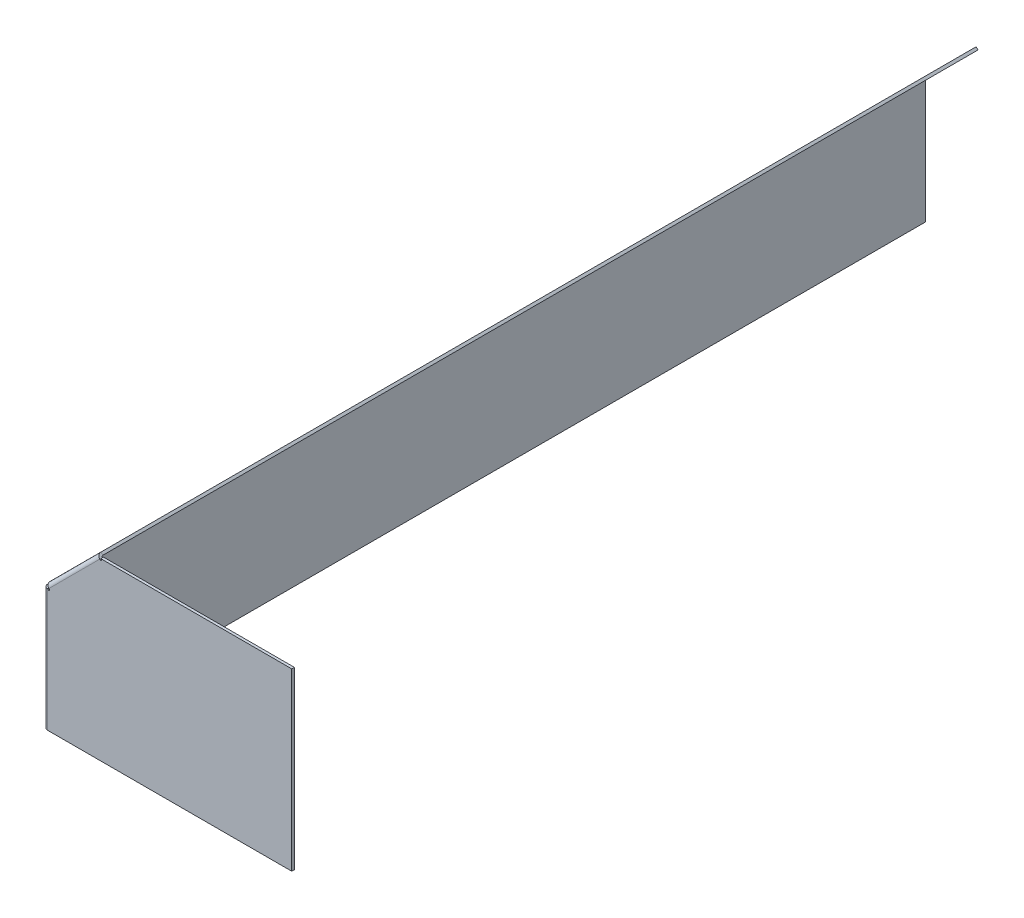
ISO-10303-21;
HEADER;
FILE_DESCRIPTION(('STEP AP214'),'2;1');
FILE_NAME('part.step','',(''),(''),'','','');
FILE_SCHEMA(('AUTOMOTIVE_DESIGN { 1 0 10303 214 1 1 1 1 }'));
ENDSEC;
DATA;
#1=APPLICATION_CONTEXT('core data for automotive mechanical design processes');
#2=APPLICATION_PROTOCOL_DEFINITION('international standard','automotive_design',2000,#1);
#3=PRODUCT_CONTEXT('',#1,'mechanical');
#4=PRODUCT('Part','Part','',(#3));
#5=PRODUCT_RELATED_PRODUCT_CATEGORY('part','',(#4));
#6=PRODUCT_DEFINITION_FORMATION('','',#4);
#7=PRODUCT_DEFINITION_CONTEXT('part definition',#1,'design');
#8=PRODUCT_DEFINITION('design','',#6,#7);
#9=PRODUCT_DEFINITION_SHAPE('','',#8);
#10=(LENGTH_UNIT() NAMED_UNIT(*) SI_UNIT(.MILLI.,.METRE.));
#11=(NAMED_UNIT(*) PLANE_ANGLE_UNIT() SI_UNIT($,.RADIAN.));
#12=(NAMED_UNIT(*) SI_UNIT($,.STERADIAN.) SOLID_ANGLE_UNIT());
#13=UNCERTAINTY_MEASURE_WITH_UNIT(LENGTH_MEASURE(1.E-05),#10,'distance_accuracy_value','');
#14=(GEOMETRIC_REPRESENTATION_CONTEXT(3) GLOBAL_UNCERTAINTY_ASSIGNED_CONTEXT((#13)) GLOBAL_UNIT_ASSIGNED_CONTEXT((#10,
#11,#12)) REPRESENTATION_CONTEXT('',''));
#15=CARTESIAN_POINT('',(0.,0.,0.));
#16=DIRECTION('',(0.,0.,1.));
#17=DIRECTION('',(1.,0.,0.));
#18=AXIS2_PLACEMENT_3D('',#15,#16,#17);
#19=CARTESIAN_POINT('',(0.,0.,-1.5));
#20=DIRECTION('',(0.,0.,-1.));
#21=DIRECTION('',(-1.,0.,0.));
#22=AXIS2_PLACEMENT_3D('',#19,#20,#21);
#23=PLANE('',#22);
#24=DIRECTION('',(-0.707106781186547,-0.707106781186547,0.));
#25=VECTOR('',#24,1.);
#26=CARTESIAN_POINT('',(-38.4184849731982,49.479145144978,-1.49999999999999));
#27=LINE('',#26,#25);
#28=CARTESIAN_POINT('',(-38.4184849731982,49.479145144978,-1.49999999999999));
#29=VERTEX_POINT('',#28);
#30=CARTESIAN_POINT('',(-38.9488150590881,48.9488150590881,-1.49999999999999));
#31=VERTEX_POINT('',#30);
#32=EDGE_CURVE('E378',#29,#31,#27,.T.);
#33=ORIENTED_EDGE('',*,*,#32,.F.);
#34=DIRECTION('',(0.707106781186547,-0.707106781186547,0.));
#35=VECTOR('',#34,1.);
#36=CARTESIAN_POINT('',(-38.9393398282202,50.,-1.5));
#37=LINE('',#36,#35);
#38=CARTESIAN_POINT('',(-38.9393398282202,50.,-1.5));
#39=VERTEX_POINT('',#38);
#40=EDGE_CURVE('E747',#39,#29,#37,.T.);
#41=ORIENTED_EDGE('',*,*,#40,.F.);
#42=DIRECTION('',(-1.,0.,0.));
#43=VECTOR('',#42,1.);
#44=CARTESIAN_POINT('',(-40.,50.,-1.5));
#45=LINE('',#44,#43);
#46=CARTESIAN_POINT('',(70.,50.,-1.5));
#47=VERTEX_POINT('',#46);
#48=EDGE_CURVE('E335',#47,#39,#45,.T.);
#49=ORIENTED_EDGE('',*,*,#48,.F.);
#50=DIRECTION('',(0.,1.,0.));
#51=VECTOR('',#50,1.);
#52=CARTESIAN_POINT('',(70.,-50.,-1.5));
#53=LINE('',#52,#51);
#54=CARTESIAN_POINT('',(70.,-50.,-1.5));
#55=VERTEX_POINT('',#54);
#56=EDGE_CURVE('E344',#55,#47,#53,.T.);
#57=ORIENTED_EDGE('',*,*,#56,.F.);
#58=DIRECTION('',(1.,0.,0.));
#59=VECTOR('',#58,1.);
#60=CARTESIAN_POINT('',(-70.,-50.,-1.5));
#61=LINE('',#60,#59);
#62=CARTESIAN_POINT('',(-69.2634,-50.,-1.5));
#63=VERTEX_POINT('',#62);
#64=EDGE_CURVE('E343',#63,#55,#61,.T.);
#65=ORIENTED_EDGE('',*,*,#64,.F.);
#66=DIRECTION('',(0.,1.,0.));
#67=VECTOR('',#66,1.);
#68=CARTESIAN_POINT('',(-69.2634,20.,-1.5));
#69=LINE('',#68,#67);
#70=CARTESIAN_POINT('',(-69.2634,20.,-1.5));
#71=VERTEX_POINT('',#70);
#72=EDGE_CURVE('E436',#71,#63,#69,.F.);
#73=ORIENTED_EDGE('',*,*,#72,.F.);
#74=DIRECTION('',(-1.,0.,0.));
#75=VECTOR('',#74,1.);
#76=CARTESIAN_POINT('',(-68.5134,20.,-1.5));
#77=LINE('',#76,#75);
#78=CARTESIAN_POINT('',(-69.1291698818238,20.,-1.5));
#79=VERTEX_POINT('',#78);
#80=EDGE_CURVE('E59',#79,#71,#77,.T.);
#81=ORIENTED_EDGE('',*,*,#80,.F.);
#82=DIRECTION('',(-0.707106781186547,0.707106781186547,0.));
#83=VECTOR('',#82,1.);
#84=CARTESIAN_POINT('',(-68.5134,19.3842301181762,-1.49999999999999));
#85=LINE('',#84,#83);
#86=CARTESIAN_POINT('',(-68.5134,19.3842301181762,-1.49999999999999));
#87=VERTEX_POINT('',#86);
#88=EDGE_CURVE('E52',#87,#79,#85,.T.);
#89=ORIENTED_EDGE('',*,*,#88,.F.);
#90=DIRECTION('',(-0.70710678118655,-0.707106781186545,0.));
#91=VECTOR('',#90,1.);
#92=CARTESIAN_POINT('',(-67.9830699141101,19.9145602040661,-1.49999999999999));
#93=LINE('',#92,#91);
#94=CARTESIAN_POINT('',(-67.9830699141101,19.9145602040661,-1.49999999999999));
#95=VERTEX_POINT('',#94);
#96=EDGE_CURVE('E755',#95,#87,#93,.T.);
#97=ORIENTED_EDGE('',*,*,#96,.F.);
#98=DIRECTION('',(0.70710678118655,-0.707106781186545,0.));
#99=VECTOR('',#98,1.);
#100=CARTESIAN_POINT('',(-68.5134,20.444890289956,-1.49999999999999));
#101=LINE('',#100,#99);
#102=CARTESIAN_POINT('',(-68.5134,20.444890289956,-1.49999999999999));
#103=VERTEX_POINT('',#102);
#104=EDGE_CURVE('E381',#103,#95,#101,.T.);
#105=ORIENTED_EDGE('',*,*,#104,.F.);
#106=DIRECTION('',(0.707106781186547,0.707106781186547,0.));
#107=VECTOR('',#106,1.);
#108=CARTESIAN_POINT('',(-39.479145144978,49.479145144978,-1.49999999999999));
#109=LINE('',#108,#107);
#110=CARTESIAN_POINT('',(-39.479145144978,49.479145144978,-1.49999999999999));
#111=VERTEX_POINT('',#110);
#112=EDGE_CURVE('E217',#111,#103,#109,.F.);
#113=ORIENTED_EDGE('',*,*,#112,.F.);
#114=DIRECTION('',(-0.707106781186547,0.707106781186547,0.));
#115=VECTOR('',#114,1.);
#116=CARTESIAN_POINT('',(-38.9488150590881,48.9488150590881,-1.49999999999999));
#117=LINE('',#116,#115);
#118=EDGE_CURVE('E380',#31,#111,#117,.T.);
#119=ORIENTED_EDGE('',*,*,#118,.F.);
#120=EDGE_LOOP('',(#33,#41,#49,#57,#65,#73,#81,#89,#97,#105,#113,#119));
#121=FACE_BOUND('',#120,.T.);
#122=ADVANCED_FACE('F37',(#121),#23,.T.);
#123=CARTESIAN_POINT('',(0.,0.,0.));
#124=DIRECTION('',(0.,0.,-1.));
#125=DIRECTION('',(-1.,0.,0.));
#126=AXIS2_PLACEMENT_3D('',#123,#124,#125);
#127=PLANE('',#126);
#128=DIRECTION('',(-0.707106781186548,0.707106781186548,0.));
#129=VECTOR('',#128,1.);
#130=CARTESIAN_POINT('',(5.5303300858899,5.5303300858899,0.));
#131=LINE('',#130,#129);
#132=CARTESIAN_POINT('',(-38.4184849731982,49.479145144978,0.));
#133=VERTEX_POINT('',#132);
#134=CARTESIAN_POINT('',(-38.9393398282202,50.,0.));
#135=VERTEX_POINT('',#134);
#136=EDGE_CURVE('E384',#133,#135,#131,.T.);
#137=ORIENTED_EDGE('',*,*,#136,.F.);
#138=DIRECTION('',(0.707106781186548,0.707106781186548,0.));
#139=VECTOR('',#138,1.);
#140=CARTESIAN_POINT('',(-43.9488150590881,43.9488150590881,0.));
#141=LINE('',#140,#139);
#142=CARTESIAN_POINT('',(-38.9488150590881,48.9488150590881,0.));
#143=VERTEX_POINT('',#142);
#144=EDGE_CURVE('E11',#143,#133,#141,.T.);
#145=ORIENTED_EDGE('',*,*,#144,.F.);
#146=DIRECTION('',(0.707106781186548,-0.707106781186548,0.));
#147=VECTOR('',#146,1.);
#148=CARTESIAN_POINT('',(4.99999999999999,4.99999999999999,0.));
#149=LINE('',#148,#147);
#150=CARTESIAN_POINT('',(-39.479145144978,49.479145144978,0.));
#151=VERTEX_POINT('',#150);
#152=EDGE_CURVE('E45',#151,#143,#149,.T.);
#153=ORIENTED_EDGE('',*,*,#152,.F.);
#154=DIRECTION('',(0.707106781186547,0.707106781186547,0.));
#155=VECTOR('',#154,1.);
#156=CARTESIAN_POINT('',(-39.479145144978,49.479145144978,0.));
#157=LINE('',#156,#155);
#158=CARTESIAN_POINT('',(-68.5134,20.444890289956,0.));
#159=VERTEX_POINT('',#158);
#160=EDGE_CURVE('E213',#151,#159,#157,.F.);
#161=ORIENTED_EDGE('',*,*,#160,.T.);
#162=DIRECTION('',(-0.70710678118655,0.707106781186545,0.));
#163=VECTOR('',#162,1.);
#164=CARTESIAN_POINT('',(-24.0342548550218,-24.0342548550219,0.));
#165=LINE('',#164,#163);
#166=CARTESIAN_POINT('',(-67.9830699141101,19.9145602040661,0.));
#167=VERTEX_POINT('',#166);
#168=EDGE_CURVE('E386',#167,#159,#165,.T.);
#169=ORIENTED_EDGE('',*,*,#168,.F.);
#170=DIRECTION('',(0.70710678118655,0.707106781186545,0.));
#171=VECTOR('',#170,1.);
#172=CARTESIAN_POINT('',(-43.9488150590879,43.9488150590882,0.));
#173=LINE('',#172,#171);
#174=CARTESIAN_POINT('',(-68.5134,19.3842301181762,0.));
#175=VERTEX_POINT('',#174);
#176=EDGE_CURVE('E366',#175,#167,#173,.T.);
#177=ORIENTED_EDGE('',*,*,#176,.F.);
#178=DIRECTION('',(0.707106781186548,-0.707106781186548,0.));
#179=VECTOR('',#178,1.);
#180=CARTESIAN_POINT('',(-24.5645849409119,-24.5645849409119,0.));
#181=LINE('',#180,#179);
#182=CARTESIAN_POINT('',(-69.1291698818238,20.,0.));
#183=VERTEX_POINT('',#182);
#184=EDGE_CURVE('E391',#183,#175,#181,.T.);
#185=ORIENTED_EDGE('',*,*,#184,.F.);
#186=DIRECTION('',(1.,0.,0.));
#187=VECTOR('',#186,1.);
#188=CARTESIAN_POINT('',(0.,20.,0.));
#189=LINE('',#188,#187);
#190=CARTESIAN_POINT('',(-69.2634,20.,0.));
#191=VERTEX_POINT('',#190);
#192=EDGE_CURVE('E360',#191,#183,#189,.T.);
#193=ORIENTED_EDGE('',*,*,#192,.F.);
#194=DIRECTION('',(0.,1.,0.));
#195=VECTOR('',#194,1.);
#196=CARTESIAN_POINT('',(-69.2634,20.,0.));
#197=LINE('',#196,#195);
#198=CARTESIAN_POINT('',(-69.2634,-50.,0.));
#199=VERTEX_POINT('',#198);
#200=EDGE_CURVE('E424',#191,#199,#197,.F.);
#201=ORIENTED_EDGE('',*,*,#200,.T.);
#202=DIRECTION('',(1.,0.,0.));
#203=VECTOR('',#202,1.);
#204=CARTESIAN_POINT('',(-70.,-50.,0.));
#205=LINE('',#204,#203);
#206=CARTESIAN_POINT('',(70.,-50.,0.));
#207=VERTEX_POINT('',#206);
#208=EDGE_CURVE('E347',#199,#207,#205,.T.);
#209=ORIENTED_EDGE('',*,*,#208,.T.);
#210=DIRECTION('',(0.,1.,0.));
#211=VECTOR('',#210,1.);
#212=CARTESIAN_POINT('',(70.,-50.,0.));
#213=LINE('',#212,#211);
#214=CARTESIAN_POINT('',(70.,50.,0.));
#215=VERTEX_POINT('',#214);
#216=EDGE_CURVE('E351',#207,#215,#213,.T.);
#217=ORIENTED_EDGE('',*,*,#216,.T.);
#218=DIRECTION('',(-1.,0.,0.));
#219=VECTOR('',#218,1.);
#220=CARTESIAN_POINT('',(-40.,50.,0.));
#221=LINE('',#220,#219);
#222=EDGE_CURVE('E354',#215,#135,#221,.T.);
#223=ORIENTED_EDGE('',*,*,#222,.T.);
#224=EDGE_LOOP('',(#137,#145,#153,#161,#169,#177,#185,#193,#201,#209,#217,#223));
#225=FACE_BOUND('',#224,.T.);
#226=ADVANCED_FACE('F321',(#225),#127,.F.);
#227=CARTESIAN_POINT('',(-40.,50.,-1.5));
#228=DIRECTION('',(0.,1.,0.));
#229=DIRECTION('',(0.,0.,1.));
#230=AXIS2_PLACEMENT_3D('',#227,#228,#229);
#231=PLANE('',#230);
#232=ORIENTED_EDGE('',*,*,#48,.T.);
#233=DIRECTION('',(0.,0.,1.));
#234=VECTOR('',#233,1.);
#235=CARTESIAN_POINT('',(-38.9393398282202,50.,-1.5));
#236=LINE('',#235,#234);
#237=EDGE_CURVE('E337',#39,#135,#236,.T.);
#238=ORIENTED_EDGE('',*,*,#237,.T.);
#239=ORIENTED_EDGE('',*,*,#222,.F.);
#240=DIRECTION('',(0.,0.,1.));
#241=VECTOR('',#240,1.);
#242=CARTESIAN_POINT('',(70.,50.,-1.5));
#243=LINE('',#242,#241);
#244=EDGE_CURVE('E339',#47,#215,#243,.T.);
#245=ORIENTED_EDGE('',*,*,#244,.F.);
#246=EDGE_LOOP('',(#232,#238,#239,#245));
#247=FACE_BOUND('',#246,.T.);
#248=ADVANCED_FACE('F318',(#247),#231,.T.);
#249=CARTESIAN_POINT('',(-68.5134,20.,-1.5));
#250=DIRECTION('',(0.,1.,0.));
#251=DIRECTION('',(0.,0.,1.));
#252=AXIS2_PLACEMENT_3D('',#249,#250,#251);
#253=PLANE('',#252);
#254=ORIENTED_EDGE('',*,*,#192,.T.);
#255=DIRECTION('',(0.,0.,-1.));
#256=VECTOR('',#255,1.);
#257=CARTESIAN_POINT('',(-69.1291698818238,20.,-1.5));
#258=LINE('',#257,#256);
#259=EDGE_CURVE('E364',#183,#79,#258,.T.);
#260=ORIENTED_EDGE('',*,*,#259,.T.);
#261=ORIENTED_EDGE('',*,*,#80,.T.);
#262=DIRECTION('',(0.,0.,1.));
#263=VECTOR('',#262,1.);
#264=CARTESIAN_POINT('',(-69.2634,20.,-1.5));
#265=LINE('',#264,#263);
#266=EDGE_CURVE('E430',#71,#191,#265,.T.);
#267=ORIENTED_EDGE('',*,*,#266,.T.);
#268=EDGE_LOOP('',(#254,#260,#261,#267));
#269=FACE_BOUND('',#268,.T.);
#270=ADVANCED_FACE('F315',(#269),#253,.T.);
#271=CARTESIAN_POINT('',(70.,-50.,-1.5));
#272=DIRECTION('',(1.,0.,0.));
#273=DIRECTION('',(0.,0.,-1.));
#274=AXIS2_PLACEMENT_3D('',#271,#272,#273);
#275=PLANE('',#274);
#276=ORIENTED_EDGE('',*,*,#216,.F.);
#277=DIRECTION('',(0.,0.,1.));
#278=VECTOR('',#277,1.);
#279=CARTESIAN_POINT('',(70.,-50.,-1.5));
#280=LINE('',#279,#278);
#281=EDGE_CURVE('E357',#55,#207,#280,.T.);
#282=ORIENTED_EDGE('',*,*,#281,.F.);
#283=ORIENTED_EDGE('',*,*,#56,.T.);
#284=ORIENTED_EDGE('',*,*,#244,.T.);
#285=EDGE_LOOP('',(#276,#282,#283,#284));
#286=FACE_BOUND('',#285,.T.);
#287=ADVANCED_FACE('F39',(#286),#275,.T.);
#288=CARTESIAN_POINT('',(-70.,-50.,-1.5));
#289=DIRECTION('',(0.,-1.,0.));
#290=DIRECTION('',(0.,0.,-1.));
#291=AXIS2_PLACEMENT_3D('',#288,#289,#290);
#292=PLANE('',#291);
#293=DIRECTION('',(0.,0.,1.));
#294=VECTOR('',#293,1.);
#295=CARTESIAN_POINT('',(-69.2634,-50.,-1.5));
#296=LINE('',#295,#294);
#297=EDGE_CURVE('E441',#63,#199,#296,.T.);
#298=ORIENTED_EDGE('',*,*,#297,.F.);
#299=ORIENTED_EDGE('',*,*,#64,.T.);
#300=ORIENTED_EDGE('',*,*,#281,.T.);
#301=ORIENTED_EDGE('',*,*,#208,.F.);
#302=EDGE_LOOP('',(#298,#299,#300,#301));
#303=FACE_BOUND('',#302,.T.);
#304=ADVANCED_FACE('F310',(#303),#292,.T.);
#305=CARTESIAN_POINT('',(-69.2634,-50.,-2.23660000000001));
#306=DIRECTION('',(0.,-1.,0.));
#307=DIRECTION('',(0.,0.,-1.));
#308=AXIS2_PLACEMENT_3D('',#305,#306,#307);
#309=PLANE('',#308);
#310=DIRECTION('',(-1.,0.,0.));
#311=VECTOR('',#310,1.);
#312=CARTESIAN_POINT('',(-70.,-50.,-2.23660000000001));
#313=LINE('',#312,#311);
#314=CARTESIAN_POINT('',(-70.,-50.,-2.23660000000001));
#315=VERTEX_POINT('',#314);
#316=CARTESIAN_POINT('',(-71.5,-50.,-2.2366));
#317=VERTEX_POINT('',#316);
#318=EDGE_CURVE('E385',#315,#317,#313,.T.);
#319=ORIENTED_EDGE('',*,*,#318,.F.);
#320=CARTESIAN_POINT('',(-69.2634,-50.,-2.23660000000001));
#321=DIRECTION('',(0.,1.,0.));
#322=DIRECTION('',(0.,0.,1.));
#323=AXIS2_PLACEMENT_3D('',#320,#321,#322);
#324=CIRCLE('',#323,0.736600000000004);
#325=EDGE_CURVE('E433',#63,#315,#324,.F.);
#326=ORIENTED_EDGE('',*,*,#325,.F.);
#327=ORIENTED_EDGE('',*,*,#297,.T.);
#328=CARTESIAN_POINT('',(-69.2634,-50.,-2.23660000000001));
#329=DIRECTION('',(0.,1.,0.));
#330=DIRECTION('',(0.,0.,1.));
#331=AXIS2_PLACEMENT_3D('',#328,#329,#330);
#332=CIRCLE('',#331,2.2366);
#333=EDGE_CURVE('E426',#199,#317,#332,.F.);
#334=ORIENTED_EDGE('',*,*,#333,.T.);
#335=EDGE_LOOP('',(#319,#326,#327,#334));
#336=FACE_BOUND('',#335,.T.);
#337=ADVANCED_FACE('F307',(#336),#309,.T.);
#338=CARTESIAN_POINT('',(-69.2634,20.,-2.23660000000001));
#339=DIRECTION('',(0.,-1.,0.));
#340=DIRECTION('',(0.,0.,-1.));
#341=AXIS2_PLACEMENT_3D('',#338,#339,#340);
#342=PLANE('',#341);
#343=CARTESIAN_POINT('',(-69.2634,20.,-2.23660000000001));
#344=DIRECTION('',(0.,1.,0.));
#345=DIRECTION('',(0.,0.,1.));
#346=AXIS2_PLACEMENT_3D('',#343,#344,#345);
#347=CIRCLE('',#346,0.736600000000004);
#348=CARTESIAN_POINT('',(-70.,20.,-2.23660000000001));
#349=VERTEX_POINT('',#348);
#350=EDGE_CURVE('E421',#349,#71,#347,.T.);
#351=ORIENTED_EDGE('',*,*,#350,.F.);
#352=DIRECTION('',(-1.,0.,0.));
#353=VECTOR('',#352,1.);
#354=CARTESIAN_POINT('',(-70.,20.,-2.23660000000001));
#355=LINE('',#354,#353);
#356=CARTESIAN_POINT('',(-71.5,20.,-2.2366));
#357=VERTEX_POINT('',#356);
#358=EDGE_CURVE('E396',#349,#357,#355,.T.);
#359=ORIENTED_EDGE('',*,*,#358,.T.);
#360=CARTESIAN_POINT('',(-69.2634,20.,-2.23660000000001));
#361=DIRECTION('',(0.,1.,0.));
#362=DIRECTION('',(0.,0.,1.));
#363=AXIS2_PLACEMENT_3D('',#360,#361,#362);
#364=CIRCLE('',#363,2.2366);
#365=EDGE_CURVE('E427',#357,#191,#364,.T.);
#366=ORIENTED_EDGE('',*,*,#365,.T.);
#367=ORIENTED_EDGE('',*,*,#266,.F.);
#368=EDGE_LOOP('',(#351,#359,#366,#367));
#369=FACE_BOUND('',#368,.T.);
#370=ADVANCED_FACE('F302',(#369),#342,.F.);
#371=CARTESIAN_POINT('',(-69.2634,20.,-2.23660000000001));
#372=DIRECTION('',(0.,1.,0.));
#373=DIRECTION('',(-1.,0.,0.));
#374=AXIS2_PLACEMENT_3D('',#371,#372,#373);
#375=CYLINDRICAL_SURFACE('',#374,2.2366);
#376=ORIENTED_EDGE('',*,*,#200,.F.);
#377=ORIENTED_EDGE('',*,*,#365,.F.);
#378=DIRECTION('',(0.,1.,0.));
#379=VECTOR('',#378,1.);
#380=CARTESIAN_POINT('',(-71.5,0.,-2.2366));
#381=LINE('',#380,#379);
#382=EDGE_CURVE('E398',#317,#357,#381,.T.);
#383=ORIENTED_EDGE('',*,*,#382,.F.);
#384=ORIENTED_EDGE('',*,*,#333,.F.);
#385=EDGE_LOOP('',(#376,#377,#383,#384));
#386=FACE_BOUND('',#385,.T.);
#387=ADVANCED_FACE('F299',(#386),#375,.T.);
#388=CARTESIAN_POINT('',(-69.2634,20.,-2.23660000000001));
#389=DIRECTION('',(0.,1.,0.));
#390=DIRECTION('',(-1.,0.,0.));
#391=AXIS2_PLACEMENT_3D('',#388,#389,#390);
#392=CYLINDRICAL_SURFACE('',#391,0.736600000000004);
#393=ORIENTED_EDGE('',*,*,#72,.T.);
#394=ORIENTED_EDGE('',*,*,#325,.T.);
#395=DIRECTION('',(0.,1.,0.));
#396=VECTOR('',#395,1.);
#397=CARTESIAN_POINT('',(-70.,-50.,-2.23660000000001));
#398=LINE('',#397,#396);
#399=EDGE_CURVE('E389',#315,#349,#398,.T.);
#400=ORIENTED_EDGE('',*,*,#399,.T.);
#401=ORIENTED_EDGE('',*,*,#350,.T.);
#402=EDGE_LOOP('',(#393,#394,#400,#401));
#403=FACE_BOUND('',#402,.T.);
#404=ADVANCED_FACE('F291',(#403),#392,.F.);
#405=CARTESIAN_POINT('',(-71.5,20.,-1.49999999999999));
#406=DIRECTION('',(0.,1.,0.));
#407=DIRECTION('',(0.,0.,1.));
#408=AXIS2_PLACEMENT_3D('',#405,#406,#407);
#409=PLANE('',#408);
#410=DIRECTION('',(0.,0.,1.));
#411=VECTOR('',#410,1.);
#412=CARTESIAN_POINT('',(-71.5,20.,-1.49999999999999));
#413=LINE('',#412,#411);
#414=CARTESIAN_POINT('',(-71.5000000000018,20.,-501.5));
#415=VERTEX_POINT('',#414);
#416=EDGE_CURVE('E409',#415,#357,#413,.T.);
#417=ORIENTED_EDGE('',*,*,#416,.T.);
#418=ORIENTED_EDGE('',*,*,#358,.F.);
#419=DIRECTION('',(0.,0.,1.));
#420=VECTOR('',#419,1.);
#421=CARTESIAN_POINT('',(-70.,20.,-1.5));
#422=LINE('',#421,#420);
#423=CARTESIAN_POINT('',(-70.0000000000018,20.,-501.5));
#424=VERTEX_POINT('',#423);
#425=EDGE_CURVE('E406',#424,#349,#422,.T.);
#426=ORIENTED_EDGE('',*,*,#425,.F.);
#427=DIRECTION('',(1.,0.,0.));
#428=VECTOR('',#427,1.);
#429=CARTESIAN_POINT('',(-71.5000000000018,20.,-501.5));
#430=LINE('',#429,#428);
#431=EDGE_CURVE('E419',#415,#424,#430,.T.);
#432=ORIENTED_EDGE('',*,*,#431,.F.);
#433=EDGE_LOOP('',(#417,#418,#426,#432));
#434=FACE_BOUND('',#433,.T.);
#435=ADVANCED_FACE('F288',(#434),#409,.T.);
#436=CARTESIAN_POINT('',(-71.5000000000018,-50.,-501.5));
#437=DIRECTION('',(0.,-1.,0.));
#438=DIRECTION('',(0.,0.,-1.));
#439=AXIS2_PLACEMENT_3D('',#436,#437,#438);
#440=PLANE('',#439);
#441=DIRECTION('',(0.,0.,-1.));
#442=VECTOR('',#441,1.);
#443=CARTESIAN_POINT('',(-70.0000000000018,-50.,-501.5));
#444=LINE('',#443,#442);
#445=CARTESIAN_POINT('',(-70.0000000000018,-50.,-501.5));
#446=VERTEX_POINT('',#445);
#447=EDGE_CURVE('E402',#315,#446,#444,.T.);
#448=ORIENTED_EDGE('',*,*,#447,.F.);
#449=ORIENTED_EDGE('',*,*,#318,.T.);
#450=DIRECTION('',(0.,0.,-1.));
#451=VECTOR('',#450,1.);
#452=CARTESIAN_POINT('',(-71.5000000000018,-50.,-501.5));
#453=LINE('',#452,#451);
#454=CARTESIAN_POINT('',(-71.5000000000018,-50.,-501.5));
#455=VERTEX_POINT('',#454);
#456=EDGE_CURVE('E403',#317,#455,#453,.T.);
#457=ORIENTED_EDGE('',*,*,#456,.T.);
#458=DIRECTION('',(1.,0.,0.));
#459=VECTOR('',#458,1.);
#460=CARTESIAN_POINT('',(-71.5000000000018,-50.,-501.5));
#461=LINE('',#460,#459);
#462=EDGE_CURVE('E412',#455,#446,#461,.T.);
#463=ORIENTED_EDGE('',*,*,#462,.T.);
#464=EDGE_LOOP('',(#448,#449,#457,#463));
#465=FACE_BOUND('',#464,.T.);
#466=ADVANCED_FACE('F283',(#465),#440,.T.);
#467=CARTESIAN_POINT('',(-71.5,0.,2.50041398938112E-13));
#468=DIRECTION('',(-1.,0.,0.));
#469=DIRECTION('',(0.,0.,1.));
#470=AXIS2_PLACEMENT_3D('',#467,#468,#469);
#471=PLANE('',#470);
#472=ORIENTED_EDGE('',*,*,#456,.F.);
#473=ORIENTED_EDGE('',*,*,#382,.T.);
#474=ORIENTED_EDGE('',*,*,#416,.F.);
#475=DIRECTION('',(0.,1.,0.));
#476=VECTOR('',#475,1.);
#477=CARTESIAN_POINT('',(-71.5000000000018,20.,-501.5));
#478=LINE('',#477,#476);
#479=EDGE_CURVE('E405',#455,#415,#478,.T.);
#480=ORIENTED_EDGE('',*,*,#479,.F.);
#481=EDGE_LOOP('',(#472,#473,#474,#480));
#482=FACE_BOUND('',#481,.T.);
#483=ADVANCED_FACE('F279',(#482),#471,.T.);
#484=CARTESIAN_POINT('',(-70.,0.,2.44804176929847E-13));
#485=DIRECTION('',(-1.,0.,0.));
#486=DIRECTION('',(0.,0.,1.));
#487=AXIS2_PLACEMENT_3D('',#484,#485,#486);
#488=PLANE('',#487);
#489=ORIENTED_EDGE('',*,*,#399,.F.);
#490=ORIENTED_EDGE('',*,*,#447,.T.);
#491=DIRECTION('',(0.,1.,0.));
#492=VECTOR('',#491,1.);
#493=CARTESIAN_POINT('',(-70.0000000000018,20.,-501.5));
#494=LINE('',#493,#492);
#495=EDGE_CURVE('E414',#446,#424,#494,.T.);
#496=ORIENTED_EDGE('',*,*,#495,.T.);
#497=ORIENTED_EDGE('',*,*,#425,.T.);
#498=EDGE_LOOP('',(#489,#490,#496,#497));
#499=FACE_BOUND('',#498,.T.);
#500=ADVANCED_FACE('F282',(#499),#488,.F.);
#501=CARTESIAN_POINT('',(-71.5000000000018,20.,-501.5));
#502=DIRECTION('',(0.,0.,-1.));
#503=DIRECTION('',(-1.,0.,0.));
#504=AXIS2_PLACEMENT_3D('',#501,#502,#503);
#505=PLANE('',#504);
#506=ORIENTED_EDGE('',*,*,#495,.F.);
#507=ORIENTED_EDGE('',*,*,#462,.F.);
#508=ORIENTED_EDGE('',*,*,#479,.T.);
#509=ORIENTED_EDGE('',*,*,#431,.T.);
#510=EDGE_LOOP('',(#506,#507,#508,#509));
#511=FACE_BOUND('',#510,.T.);
#512=ADVANCED_FACE('F274',(#511),#505,.T.);
#513=CARTESIAN_POINT('',(-38.4184849731982,49.479145144978,-1.49999999999999));
#514=DIRECTION('',(-0.707106781186547,0.707106781186547,0.));
#515=DIRECTION('',(-0.707106781186548,-0.707106781186548,0.));
#516=AXIS2_PLACEMENT_3D('',#513,#514,#515);
#517=PLANE('',#516);
#518=DIRECTION('',(0.,0.,1.));
#519=VECTOR('',#518,1.);
#520=CARTESIAN_POINT('',(-38.9488150590881,48.9488150590881,-1.49999999999999));
#521=LINE('',#520,#519);
#522=EDGE_CURVE('E369',#31,#143,#521,.T.);
#523=ORIENTED_EDGE('',*,*,#522,.T.);
#524=ORIENTED_EDGE('',*,*,#144,.T.);
#525=DIRECTION('',(0.,0.,1.));
#526=VECTOR('',#525,1.);
#527=CARTESIAN_POINT('',(-38.4184849731982,49.479145144978,-1.49999999999999));
#528=LINE('',#527,#526);
#529=EDGE_CURVE('E751',#29,#133,#528,.T.);
#530=ORIENTED_EDGE('',*,*,#529,.F.);
#531=ORIENTED_EDGE('',*,*,#32,.T.);
#532=EDGE_LOOP('',(#523,#524,#530,#531));
#533=FACE_BOUND('',#532,.T.);
#534=ADVANCED_FACE('F270',(#533),#517,.T.);
#535=CARTESIAN_POINT('',(-38.9488150590881,48.9488150590881,-1.49999999999999));
#536=DIRECTION('',(0.707106781186547,0.707106781186547,0.));
#537=DIRECTION('',(-0.707106781186548,0.707106781186548,0.));
#538=AXIS2_PLACEMENT_3D('',#535,#536,#537);
#539=PLANE('',#538);
#540=DIRECTION('',(0.,0.,1.));
#541=VECTOR('',#540,1.);
#542=CARTESIAN_POINT('',(-39.479145144978,49.479145144978,-1.49999999999999));
#543=LINE('',#542,#541);
#544=EDGE_CURVE('E372',#111,#151,#543,.T.);
#545=ORIENTED_EDGE('',*,*,#544,.T.);
#546=ORIENTED_EDGE('',*,*,#152,.T.);
#547=ORIENTED_EDGE('',*,*,#522,.F.);
#548=ORIENTED_EDGE('',*,*,#118,.T.);
#549=EDGE_LOOP('',(#545,#546,#547,#548));
#550=FACE_BOUND('',#549,.T.);
#551=ADVANCED_FACE('F263',(#550),#539,.T.);
#552=CARTESIAN_POINT('',(-67.9830699141101,19.9145602040661,-1.49999999999999));
#553=DIRECTION('',(-0.707106781186545,0.70710678118655,0.));
#554=DIRECTION('',(-0.70710678118655,-0.707106781186545,0.));
#555=AXIS2_PLACEMENT_3D('',#552,#553,#554);
#556=PLANE('',#555);
#557=DIRECTION('',(0.,0.,1.));
#558=VECTOR('',#557,1.);
#559=CARTESIAN_POINT('',(-68.5134,19.3842301181762,-1.49999999999999));
#560=LINE('',#559,#558);
#561=EDGE_CURVE('E746',#87,#175,#560,.T.);
#562=ORIENTED_EDGE('',*,*,#561,.T.);
#563=ORIENTED_EDGE('',*,*,#176,.T.);
#564=DIRECTION('',(0.,0.,1.));
#565=VECTOR('',#564,1.);
#566=CARTESIAN_POINT('',(-67.9830699141101,19.9145602040661,-1.49999999999999));
#567=LINE('',#566,#565);
#568=EDGE_CURVE('E758',#95,#167,#567,.T.);
#569=ORIENTED_EDGE('',*,*,#568,.F.);
#570=ORIENTED_EDGE('',*,*,#96,.T.);
#571=EDGE_LOOP('',(#562,#563,#569,#570));
#572=FACE_BOUND('',#571,.T.);
#573=ADVANCED_FACE('F259',(#572),#556,.T.);
#574=CARTESIAN_POINT('',(-38.9393398282202,50.,-1.5));
#575=DIRECTION('',(-0.707106781186547,-0.707106781186547,0.));
#576=DIRECTION('',(0.707106781186548,-0.707106781186548,0.));
#577=AXIS2_PLACEMENT_3D('',#574,#575,#576);
#578=PLANE('',#577);
#579=ORIENTED_EDGE('',*,*,#529,.T.);
#580=ORIENTED_EDGE('',*,*,#136,.T.);
#581=ORIENTED_EDGE('',*,*,#237,.F.);
#582=ORIENTED_EDGE('',*,*,#40,.T.);
#583=EDGE_LOOP('',(#579,#580,#581,#582));
#584=FACE_BOUND('',#583,.T.);
#585=ADVANCED_FACE('F262',(#584),#578,.T.);
#586=CARTESIAN_POINT('',(-68.5134,20.444890289956,-1.49999999999999));
#587=DIRECTION('',(-0.707106781186545,-0.70710678118655,0.));
#588=DIRECTION('',(0.70710678118655,-0.707106781186545,0.));
#589=AXIS2_PLACEMENT_3D('',#586,#587,#588);
#590=PLANE('',#589);
#591=ORIENTED_EDGE('',*,*,#568,.T.);
#592=ORIENTED_EDGE('',*,*,#168,.T.);
#593=DIRECTION('',(0.,0.,1.));
#594=VECTOR('',#593,1.);
#595=CARTESIAN_POINT('',(-68.5134,20.444890289956,-1.49999999999999));
#596=LINE('',#595,#594);
#597=EDGE_CURVE('E735',#103,#159,#596,.T.);
#598=ORIENTED_EDGE('',*,*,#597,.F.);
#599=ORIENTED_EDGE('',*,*,#104,.T.);
#600=EDGE_LOOP('',(#591,#592,#598,#599));
#601=FACE_BOUND('',#600,.T.);
#602=ADVANCED_FACE('F258',(#601),#590,.T.);
#603=CARTESIAN_POINT('',(-68.5134,19.3842301181762,-1.49999999999999));
#604=DIRECTION('',(0.707106781186547,0.707106781186547,0.));
#605=DIRECTION('',(-0.707106781186548,0.707106781186548,0.));
#606=AXIS2_PLACEMENT_3D('',#603,#604,#605);
#607=PLANE('',#606);
#608=ORIENTED_EDGE('',*,*,#259,.F.);
#609=ORIENTED_EDGE('',*,*,#184,.T.);
#610=ORIENTED_EDGE('',*,*,#561,.F.);
#611=ORIENTED_EDGE('',*,*,#88,.T.);
#612=EDGE_LOOP('',(#608,#609,#610,#611));
#613=FACE_BOUND('',#612,.T.);
#614=ADVANCED_FACE('F246',(#613),#607,.T.);
#615=CARTESIAN_POINT('',(-68.5134,20.444890289956,0.0150000000000061));
#616=CARTESIAN_POINT('',(-68.7398275162577,20.6353538438074,0.0150000000000115));
#617=CARTESIAN_POINT('',(-68.9660919920707,20.8256672337007,-0.0436031212136046));
#618=CARTESIAN_POINT('',(-69.3871377195075,21.1747979128115,-0.269182567981528));
#619=CARTESIAN_POINT('',(-69.5817269350154,21.3334296041563,-0.436070137656224));
#620=CARTESIAN_POINT('',(-69.9124182099627,21.5922058307776,-0.852886605304439));
#621=CARTESIAN_POINT('',(-70.0484043042569,21.6922344009089,-1.10265150379684));
#622=CARTESIAN_POINT('',(-70.2438705849258,21.8157856332518,-1.64724846357659));
#623=CARTESIAN_POINT('',(-70.3032847922945,21.8392487547007,-1.94181349730964));
#624=CARTESIAN_POINT('',(-70.3212667734977,21.8212667734976,-2.23659999999994));
#625=CARTESIAN_POINT('',(-68.5134,20.444890289956,0.));
#626=CARTESIAN_POINT('',(-68.7384388579518,20.6339651892312,0.));
#627=CARTESIAN_POINT('',(-68.9633157365108,20.8228909781408,-0.0582127113636294));
#628=CARTESIAN_POINT('',(-69.3817960335652,21.1694562268692,-0.282289363806842));
#629=CARTESIAN_POINT('',(-69.5752086827196,21.3269113518606,-0.448065140292197));
#630=CARTESIAN_POINT('',(-69.9039364622584,21.5837240830734,-0.862104806104063));
#631=CARTESIAN_POINT('',(-70.0391364000492,21.6829664967012,-1.11020578850241));
#632=CARTESIAN_POINT('',(-70.2335400446604,21.8054550929863,-1.65117468184198));
#633=CARTESIAN_POINT('',(-70.2926781924416,21.8286421511181,-1.94377735408209));
#634=CARTESIAN_POINT('',(-70.3106601717799,21.8106601717798,-2.23659999999994));
#635=CARTESIAN_POINT('',(-68.5134,20.444890289956,-1.49999999999999));
#636=CARTESIAN_POINT('',(-68.5995730273613,20.4950997316056,-1.49999999999999));
#637=CARTESIAN_POINT('',(-68.6856901805233,20.5452654221533,-1.51917172636611));
#638=CARTESIAN_POINT('',(-68.8476274393334,20.6352876326374,-1.59296894633824));
#639=CARTESIAN_POINT('',(-68.9233834531443,20.6750861222853,-1.64756540388949));
#640=CARTESIAN_POINT('',(-69.0557616918337,20.7355493126487,-1.78392488606646));
#641=CARTESIAN_POINT('',(-69.1123459792785,20.7561760759305,-1.86563425905878));
#642=CARTESIAN_POINT('',(-69.2004860181165,20.7724010664425,-2.04379650838093));
#643=CARTESIAN_POINT('',(-69.2320182071442,20.7679817928558,-2.14016303132741));
#644=CARTESIAN_POINT('',(-69.25,20.75,-2.23659999999998));
#645=CARTESIAN_POINT('',(-68.5134,20.444890289956,-1.51514999999999));
#646=CARTESIAN_POINT('',(-68.5981704824723,20.4936971904836,-1.51514999999999));
#647=CARTESIAN_POINT('',(-68.6828861624078,20.5424614040378,-1.53392741241763));
#648=CARTESIAN_POINT('',(-68.8422323365317,20.6298925298357,-1.60620681012181));
#649=CARTESIAN_POINT('',(-68.9168000183256,20.6685026874666,-1.65968035655182));
#650=CARTESIAN_POINT('',(-69.0471951266524,20.7269827474674,-1.79323526887408));
#651=CARTESIAN_POINT('',(-69.1029853960287,20.7468154926807,-1.8732640866114));
#652=CARTESIAN_POINT('',(-69.1900521724484,20.7619672207744,-2.04776198882898));
#653=CARTESIAN_POINT('',(-69.2213055412927,20.7572691232374,-2.14214652666759));
#654=CARTESIAN_POINT('',(-69.2392873322651,20.739287332265,-2.23659999999998));
#655=B_SPLINE_SURFACE_WITH_KNOTS('',1,3,((#615,#616,#617,#618,#619,#620,#621,#622,#623,#624),
(#625,#626,#627,#628,#629,#630,#631,#632,#633,#634),(#635,#636,#637,#638,#639,#640,#641,#642,
#643,#644),(#645,#646,#647,#648,#649,#650,#651,#652,#653,#654)),.UNSPECIFIED.,.F.,.F.,.F.,(2,1,
1,2),(4,2,2,2,4),(-0.01,0.,1.,1.0101),(0.,0.25,0.5,0.75,1.),.UNSPECIFIED.);
#656=DIRECTION('',(-0.707106781186548,0.707106781186547,0.));
#657=VECTOR('',#656,1.);
#658=CARTESIAN_POINT('',(-69.25,20.75,-2.23659999999999));
#659=LINE('',#658,#657);
#660=CARTESIAN_POINT('',(-69.25,20.75,-2.23659999999999));
#661=VERTEX_POINT('',#660);
#662=CARTESIAN_POINT('',(-70.3106601717798,21.8106601717799,-2.23659999999999));
#663=VERTEX_POINT('',#662);
#664=EDGE_CURVE('E180',#661,#663,#659,.T.);
#665=CARTESIAN_POINT('',(-68.5134,20.444890289956,-1.49999999999999));
#666=CARTESIAN_POINT('',(-68.5241698215026,20.4511654209382,-1.4999997443344));
#667=CARTESIAN_POINT('',(-68.5349396276223,20.4574405365375,-1.50029580594561));
#668=CARTESIAN_POINT('',(-68.556458716735,20.4699702446095,-1.50147872797292));
#669=CARTESIAN_POINT('',(-68.567207999728,20.4762248370821,-1.50236558838903));
#670=CARTESIAN_POINT('',(-68.5886655502263,20.4886930065397,-1.50472827227747));
#671=CARTESIAN_POINT('',(-68.5993738177316,20.4949065835246,-1.50620409574981));
#672=CARTESIAN_POINT('',(-68.6207289569513,20.5072723417036,-1.50974106977006));
#673=CARTESIAN_POINT('',(-68.6313758286657,20.5134245228976,-1.51180222031799));
#674=CARTESIAN_POINT('',(-68.6525879403586,20.5256472535497,-1.51650490459195));
#675=CARTESIAN_POINT('',(-68.663153180337,20.5317178030078,-1.519146438318));
#676=CARTESIAN_POINT('',(-68.684181990222,20.5437572318521,-1.52500351947579));
#677=CARTESIAN_POINT('',(-68.6946455601286,20.5497261112382,-1.52821906690753));
#678=CARTESIAN_POINT('',(-68.7154512362111,20.56154240628,-1.53521643049176));
#679=CARTESIAN_POINT('',(-68.7257933423871,20.5673898219356,-1.53899824664423));
#680=CARTESIAN_POINT('',(-68.7463365900348,20.5789436885425,-1.54711903652812));
#681=CARTESIAN_POINT('',(-68.7565377315065,20.5846501394939,-1.55145801025953));
#682=CARTESIAN_POINT('',(-68.7767798883502,20.5959029152968,-1.56068266244482));
#683=CARTESIAN_POINT('',(-68.7868209037221,20.6014492401483,-1.56556834089871));
#684=CARTESIAN_POINT('',(-68.8067240327332,20.6123629881187,-1.57587463247181));
#685=CARTESIAN_POINT('',(-68.8165861463723,20.6177304112374,-1.58129524559102));
#686=CARTESIAN_POINT('',(-68.8361131272736,20.628268011098,-1.59265834777096));
#687=CARTESIAN_POINT('',(-68.8457779945358,20.6334381878398,-1.59860083683169));
#688=CARTESIAN_POINT('',(-68.8648926132229,20.6435634254862,-1.61099337491588));
#689=CARTESIAN_POINT('',(-68.874342364648,20.6485184863908,-1.61744342393934));
#690=CARTESIAN_POINT('',(-68.8930094004335,20.6581961411356,-1.63083554321652));
#691=CARTESIAN_POINT('',(-68.902226684794,20.6629187349758,-1.63777761347023));
#692=CARTESIAN_POINT('',(-68.9204119952569,20.6721146643978,-1.65213705115246));
#693=CARTESIAN_POINT('',(-68.9293800213591,20.6765879999798,-1.65955441858097));
#694=CARTESIAN_POINT('',(-68.9470506245966,20.6852692221765,-1.67484658152502));
#695=CARTESIAN_POINT('',(-68.9557532017319,20.6894771087913,-1.68272137704055));
#696=CARTESIAN_POINT('',(-68.9728773558162,20.697611881835,-1.69890942508649));
#697=CARTESIAN_POINT('',(-68.9812989327653,20.7015387682637,-1.70722267761689));
#698=CARTESIAN_POINT('',(-68.9978462122127,20.7090966666703,-1.72426761233906));
#699=CARTESIAN_POINT('',(-69.0059719147108,20.7127276786481,-1.73299929453082));
#700=CARTESIAN_POINT('',(-69.0219132837786,20.7196796666751,-1.75086005318852));
#701=CARTESIAN_POINT('',(-69.0297289503483,20.7230006427244,-1.75998912965444));
#702=CARTESIAN_POINT('',(-69.0450368329854,20.7293191443208,-1.77862268411564));
#703=CARTESIAN_POINT('',(-69.0525290490529,20.7323166698679,-1.78812716211091));
#704=CARTESIAN_POINT('',(-69.0671773953324,20.7379756351066,-1.80748862251081));
#705=CARTESIAN_POINT('',(-69.0743335255444,20.7406370747983,-1.81734560491543));
#706=CARTESIAN_POINT('',(-69.0882978744202,20.7456120426333,-1.83738832780006));
#707=CARTESIAN_POINT('',(-69.0951060930839,20.7479255707766,-1.84757406828006));
#708=CARTESIAN_POINT('',(-69.1083636313197,20.7521937279717,-1.86824976897444));
#709=CARTESIAN_POINT('',(-69.1148129508918,20.7541483570234,-1.87873972918882));
#710=CARTESIAN_POINT('',(-69.1273425680189,20.7576885931098,-1.89999859811908));
#711=CARTESIAN_POINT('',(-69.1334228655739,20.7592742001444,-1.91076750683496));
#712=CARTESIAN_POINT('',(-69.1452052047545,20.7620671582843,-1.9325583295235));
#713=CARTESIAN_POINT('',(-69.1509072463801,20.7632745093895,-1.94358024349616));
#714=CARTESIAN_POINT('',(-69.1619247510148,20.7653026329834,-1.96585052394355));
#715=CARTESIAN_POINT('',(-69.1672402140239,20.7661234054721,-1.97709889041828));
#716=CARTESIAN_POINT('',(-69.1774771701397,20.7673709805472,-1.99979497756426));
#717=CARTESIAN_POINT('',(-69.1823986632465,20.7677977831337,-2.01124269823552));
#718=CARTESIAN_POINT('',(-69.1918412370078,20.7682509758541,-2.03430991523317));
#719=CARTESIAN_POINT('',(-69.1963623176622,20.7682773659881,-2.04592941155956));
#720=CARTESIAN_POINT('',(-69.2049985899872,20.7679242572724,-2.06931218740691));
#721=CARTESIAN_POINT('',(-69.2091137816578,20.7675447584226,-2.08107546692787));
#722=CARTESIAN_POINT('',(-69.216933772118,20.7663753678422,-2.10471747067792));
#723=CARTESIAN_POINT('',(-69.2206385709077,20.7655854761115,-2.11659619490701));
#724=CARTESIAN_POINT('',(-69.2276342797427,20.7635918039057,-2.14044047012531));
#725=CARTESIAN_POINT('',(-69.230925189788,20.7623880234306,-2.15240602111452));
#726=CARTESIAN_POINT('',(-69.2370905501077,20.7595640027096,-2.17639512775193));
#727=CARTESIAN_POINT('',(-69.2399650003821,20.7579437624636,-2.18841868340013));
#728=CARTESIAN_POINT('',(-69.2452961430896,20.7542855241303,-2.21249481878067));
#729=CARTESIAN_POINT('',(-69.2477528355227,20.7522475260431,-2.22454739851301));
#730=CARTESIAN_POINT('',(-69.25,20.75,-2.23659999999998));
#731=B_SPLINE_CURVE_WITH_KNOTS('',3,(#665,#666,#667,#668,#669,#670,#671,#672,#673,#674,#675,
#676,#677,#678,#679,#680,#681,#682,#683,#684,#685,#686,#687,#688,#689,#690,#691,#692,#693,#694,
#695,#696,#697,#698,#699,#700,#701,#702,#703,#704,#705,#706,#707,#708,#709,#710,#711,#712,#713,
#714,#715,#716,#717,#718,#719,#720,#721,#722,#723,#724,#725,#726,#727,#728,#729,#730),
.UNSPECIFIED.,.F.,.F.,(4,2,2,2,2,2,2,2,2,2,2,2,2,2,2,2,2,2,2,2,2,2,2,2,2,2,2,2,2,2,2,2,4),(0.,
0.0373902631353243,0.0747805262706562,0.112170789405991,0.149561052541328,0.186951315676651,
0.224341578811989,0.261731841947319,0.299122105082649,0.336512368217982,0.373902631353321,
0.411292894488646,0.448683157623982,0.486073420759311,0.523463683894645,0.560853947029981,
0.598244210165303,0.635634473300635,0.673024736435974,0.710414999571299,0.747805262706635,
0.78519552584197,0.822585788977297,0.85997605211263,0.897366315247963,0.934756578383292,
0.972146841518623,1.00953710465396,1.04692736778929,1.08431763092462,1.12170789405995,
1.15909815719528,1.19648842033062),.UNSPECIFIED.);
#732=EDGE_CURVE('E214',#103,#661,#731,.T.);
#733=CARTESIAN_POINT('',(-68.5134,20.444890289956,0.));
#734=CARTESIAN_POINT('',(-68.5415248505055,20.4685204499411,7.76298760999204E-07));
#735=CARTESIAN_POINT('',(-68.5696496543028,20.492150563218,-0.000898180257876093));
#736=CARTESIAN_POINT('',(-68.6258369458164,20.5393484736909,-0.0044899850451309));
#737=CARTESIAN_POINT('',(-68.6538994335328,20.5629162708869,-0.00718283327574882));
#738=CARTESIAN_POINT('',(-68.7098998702202,20.6099273265335,-0.0143568473741615));
#739=CARTESIAN_POINT('',(-68.7378378191912,20.6333705849842,-0.018838013241956));
#740=CARTESIAN_POINT('',(-68.793527295974,20.6800706807263,-0.0295776223835637));
#741=CARTESIAN_POINT('',(-68.8212788237858,20.7033275180177,-0.0358360656573768));
#742=CARTESIAN_POINT('',(-68.8765340141629,20.749593327354,-0.0501152180428675));
#743=CARTESIAN_POINT('',(-68.9040376767281,20.7726022993988,-0.0581359271545452));
#744=CARTESIAN_POINT('',(-68.9587362925416,20.8183115341716,-0.0759202710555915));
#745=CARTESIAN_POINT('',(-68.9859312457899,20.8410117968995,-0.0856839058449601));
#746=CARTESIAN_POINT('',(-69.0399523418333,20.8860435119022,-0.106930584357691));
#747=CARTESIAN_POINT('',(-69.0667784846284,20.9083749641769,-0.118413628081054));
#748=CARTESIAN_POINT('',(-69.1200027473331,20.9526098458409,-0.143071459542221));
#749=CARTESIAN_POINT('',(-69.1464008672427,20.9745132752301,-0.156246247280026));
#750=CARTESIAN_POINT('',(-69.1987109028332,21.0178339297799,-0.184255827890444));
#751=CARTESIAN_POINT('',(-69.2246228185141,21.0392511549403,-0.199090620763058));
#752=CARTESIAN_POINT('',(-69.2759034356273,21.0815423910128,-0.230384473237115));
#753=CARTESIAN_POINT('',(-69.3012721370597,21.1024164019248,-0.246843532838559));
#754=CARTESIAN_POINT('',(-69.3514106243029,21.1435655081272,-0.28134626747833));
#755=CARTESIAN_POINT('',(-69.3761804101137,21.1638406034177,-0.299389942516656));
#756=CARTESIAN_POINT('',(-69.425066807582,21.2037376198452,-0.337018439230077));
#757=CARTESIAN_POINT('',(-69.4491834192394,21.2233595409823,-0.356603260905171));
#758=CARTESIAN_POINT('',(-69.4967107834227,21.2618975241248,-0.397266869343029));
#759=CARTESIAN_POINT('',(-69.5201215359484,21.2808135861302,-0.418345656105792));
#760=CARTESIAN_POINT('',(-69.5661861973665,21.3178888665075,-0.461946414074927));
#761=CARTESIAN_POINT('',(-69.5888401062589,21.3360480848795,-0.484468385281298));
#762=CARTESIAN_POINT('',(-69.6333419192108,21.3715605167907,-0.530901254736444));
#763=CARTESIAN_POINT('',(-69.6551898232705,21.38891373033,-0.554812152985219));
#764=CARTESIAN_POINT('',(-69.6980324070942,21.4227669331129,-0.603965273076912));
#765=CARTESIAN_POINT('',(-69.7190270868582,21.4392669223566,-0.629207494919829));
#766=CARTESIAN_POINT('',(-69.7601180581198,21.4713685125774,-0.680962451476438));
#767=CARTESIAN_POINT('',(-69.7802143496173,21.4869701135546,-0.70747518619013));
#768=CARTESIAN_POINT('',(-69.819465544671,21.5172319275675,-0.761707296988116));
#769=CARTESIAN_POINT('',(-69.8386204482272,21.5318921406033,-0.789426673072409));
#770=CARTESIAN_POINT('',(-69.8759481356092,21.5602304469446,-0.846005288206691));
#771=CARTESIAN_POINT('',(-69.8941209194351,21.5739085402501,-0.87486452725668));
#772=CARTESIAN_POINT('',(-69.9294460015803,21.6002442413546,-0.933653343887691));
#773=CARTESIAN_POINT('',(-69.9465982998997,21.6129018491535,-0.963582921468714));
#774=CARTESIAN_POINT('',(-69.979846503694,21.6371606719071,-1.02444031218792));
#775=CARTESIAN_POINT('',(-69.9959424091689,21.6487618868617,-1.05536812532609));
#776=CARTESIAN_POINT('',(-70.0270444648812,21.6708745615332,-1.1181474793487));
#777=CARTESIAN_POINT('',(-70.0420506151186,21.6813860212502,-1.14999902023313));
#778=CARTESIAN_POINT('',(-70.0709424232722,21.7012884483631,-1.21454909659672));
#779=CARTESIAN_POINT('',(-70.0848280811885,21.710679415759,-1.24724763207588));
#780=CARTESIAN_POINT('',(-70.1114508670027,21.7283128205325,-1.31341292399169));
#781=CARTESIAN_POINT('',(-70.1241879949007,21.73655525791,-1.34687968042835));
#782=CARTESIAN_POINT('',(-70.1484884498089,21.7518663317775,-1.41450078991603));
#783=CARTESIAN_POINT('',(-70.1600517768191,21.7589349682674,-1.44865514296705));
#784=CARTESIAN_POINT('',(-70.1819821871751,21.7718759975826,-1.51756916483877));
#785=CARTESIAN_POINT('',(-70.1923492705207,21.7777483904078,-1.55232883365948));
#786=CARTESIAN_POINT('',(-70.2118676314951,21.7882773703415,-1.62236974804576));
#787=CARTESIAN_POINT('',(-70.2210189091239,21.7929339574499,-1.65765099361134));
#788=CARTESIAN_POINT('',(-70.2380890298157,21.8010146971009,-1.72865006564527));
#789=CARTESIAN_POINT('',(-70.2460078728786,21.8044388496435,-1.76436789211362));
#790=CARTESIAN_POINT('',(-70.2605994488804,21.8100410446045,-1.83615407944373));
#791=CARTESIAN_POINT('',(-70.2672721818192,21.8122190870229,-1.8722224403055));
#792=CARTESIAN_POINT('',(-70.2793609227909,21.8153184469539,-1.94462280136067));
#793=CARTESIAN_POINT('',(-70.2847769308238,21.8162397644664,-1.98095480155408));
#794=CARTESIAN_POINT('',(-70.2943444153615,21.8168178679634,-2.05379492632362));
#795=CARTESIAN_POINT('',(-70.2984958918663,21.8164746539477,-2.09030305089974));
#796=CARTESIAN_POINT('',(-70.3055303719084,21.8145197529491,-2.16340742829875));
#797=CARTESIAN_POINT('',(-70.3084133754458,21.8129080659661,-2.20000368112164));
#798=CARTESIAN_POINT('',(-70.3106601717799,21.8106601717798,-2.23659999999994));
#799=B_SPLINE_CURVE_WITH_KNOTS('',3,(#733,#734,#735,#736,#737,#738,#739,#740,#741,#742,#743,
#744,#745,#746,#747,#748,#749,#750,#751,#752,#753,#754,#755,#756,#757,#758,#759,#760,#761,#762,
#763,#764,#765,#766,#767,#768,#769,#770,#771,#772,#773,#774,#775,#776,#777,#778,#779,#780,#781,
#782,#783,#784,#785,#786,#787,#788,#789,#790,#791,#792,#793,#794,#795,#796,#797,#798),
.UNSPECIFIED.,.F.,.F.,(4,2,2,2,2,2,2,2,2,2,2,2,2,2,2,2,2,2,2,2,2,2,2,2,2,2,2,2,2,2,2,2,4),(0.,
0.110191109485622,0.220382218971257,0.330573328456879,0.440764437942501,0.550955547428131,
0.661146656913757,0.771337766399387,0.881528875885023,0.991719985370637,1.10191109485627,
1.2121022043419,1.32229331382753,1.43248442331316,1.54267553279878,1.65286664228441,
1.76305775177003,1.87324886125566,1.98343997074129,2.09363108022691,2.20382218971255,
2.31401329919818,2.4242044086838,2.53439551816943,2.64458662765506,2.75477773714068,
2.86496884662631,2.97515995611194,3.08535106559757,3.19554217508319,3.30573328456882,
3.41592439405445,3.52611550354008),.UNSPECIFIED.);
#800=EDGE_CURVE('E736',#159,#663,#799,.T.);
#801=ORIENTED_EDGE('',*,*,#664,.F.);
#802=ORIENTED_EDGE('',*,*,#732,.F.);
#803=ORIENTED_EDGE('',*,*,#597,.T.);
#804=ORIENTED_EDGE('',*,*,#800,.T.);
#805=EDGE_LOOP('',(#801,#802,#803,#804));
#806=FACE_BOUND('',#805,.T.);
#807=ADVANCED_FACE('F240',(#806),#655,.F.);
#808=CARTESIAN_POINT('',(-39.479145144978,49.479145144978,-2.23659999999999));
#809=DIRECTION('',(-0.707106781186547,-0.707106781186547,0.));
#810=DIRECTION('',(0.707106781186548,-0.707106781186548,0.));
#811=AXIS2_PLACEMENT_3D('',#808,#809,#810);
#812=PLANE('',#811);
#813=CARTESIAN_POINT('',(-39.479145144978,49.479145144978,-2.23659999999999));
#814=DIRECTION('',(0.707106781186547,0.707106781186547,0.));
#815=DIRECTION('',(-0.707106781186548,0.707106781186548,0.));
#816=AXIS2_PLACEMENT_3D('',#813,#814,#815);
#817=CIRCLE('',#816,0.7366);
#818=CARTESIAN_POINT('',(-40.,50.,-2.23659999999999));
#819=VERTEX_POINT('',#818);
#820=EDGE_CURVE('E208',#819,#111,#817,.T.);
#821=ORIENTED_EDGE('',*,*,#820,.F.);
#822=DIRECTION('',(-0.707106781186548,0.707106781186547,0.));
#823=VECTOR('',#822,1.);
#824=CARTESIAN_POINT('',(-40.,50.,-2.23659999999999));
#825=LINE('',#824,#823);
#826=CARTESIAN_POINT('',(-41.0606601717799,51.0606601717798,-2.23659999999999));
#827=VERTEX_POINT('',#826);
#828=EDGE_CURVE('E724',#819,#827,#825,.T.);
#829=ORIENTED_EDGE('',*,*,#828,.T.);
#830=CARTESIAN_POINT('',(-39.479145144978,49.479145144978,-2.23659999999999));
#831=DIRECTION('',(0.707106781186547,0.707106781186547,0.));
#832=DIRECTION('',(-0.707106781186548,0.707106781186548,0.));
#833=AXIS2_PLACEMENT_3D('',#830,#831,#832);
#834=CIRCLE('',#833,2.2366);
#835=EDGE_CURVE('E210',#827,#151,#834,.T.);
#836=ORIENTED_EDGE('',*,*,#835,.T.);
#837=ORIENTED_EDGE('',*,*,#544,.F.);
#838=EDGE_LOOP('',(#821,#829,#836,#837));
#839=FACE_BOUND('',#838,.T.);
#840=ADVANCED_FACE('F245',(#839),#812,.F.);
#841=CARTESIAN_POINT('',(-39.479145144978,49.479145144978,-2.23659999999999));
#842=DIRECTION('',(0.707106781186547,0.707106781186547,0.));
#843=DIRECTION('',(-0.707106781186548,0.707106781186548,0.));
#844=AXIS2_PLACEMENT_3D('',#841,#842,#843);
#845=CYLINDRICAL_SURFACE('',#844,2.2366);
#846=ORIENTED_EDGE('',*,*,#160,.F.);
#847=ORIENTED_EDGE('',*,*,#835,.F.);
#848=DIRECTION('',(0.707106781186547,0.707106781186548,0.));
#849=VECTOR('',#848,1.);
#850=CARTESIAN_POINT('',(-46.0606601717799,46.0606601717798,-2.23659999999999));
#851=LINE('',#850,#849);
#852=EDGE_CURVE('E204',#663,#827,#851,.T.);
#853=ORIENTED_EDGE('',*,*,#852,.F.);
#854=ORIENTED_EDGE('',*,*,#800,.F.);
#855=EDGE_LOOP('',(#846,#847,#853,#854));
#856=FACE_BOUND('',#855,.T.);
#857=ADVANCED_FACE('F236',(#856),#845,.T.);
#858=CARTESIAN_POINT('',(-39.479145144978,49.479145144978,-2.23659999999999));
#859=DIRECTION('',(0.707106781186547,0.707106781186547,0.));
#860=DIRECTION('',(-0.707106781186548,0.707106781186548,0.));
#861=AXIS2_PLACEMENT_3D('',#858,#859,#860);
#862=CYLINDRICAL_SURFACE('',#861,0.7366);
#863=ORIENTED_EDGE('',*,*,#112,.T.);
#864=ORIENTED_EDGE('',*,*,#732,.T.);
#865=DIRECTION('',(0.707106781186548,0.707106781186547,0.));
#866=VECTOR('',#865,1.);
#867=CARTESIAN_POINT('',(-69.25,20.75,-2.23659999999999));
#868=LINE('',#867,#866);
#869=EDGE_CURVE('E720',#661,#819,#868,.T.);
#870=ORIENTED_EDGE('',*,*,#869,.T.);
#871=ORIENTED_EDGE('',*,*,#820,.T.);
#872=EDGE_LOOP('',(#863,#864,#870,#871));
#873=FACE_BOUND('',#872,.T.);
#874=ADVANCED_FACE('F225',(#873),#862,.F.);
#875=CARTESIAN_POINT('',(-41.0606601717799,51.0606601717798,-1.49999999999999));
#876=DIRECTION('',(0.707106781186547,0.707106781186547,0.));
#877=DIRECTION('',(-0.707106781186548,0.707106781186548,0.));
#878=AXIS2_PLACEMENT_3D('',#875,#876,#877);
#879=PLANE('',#878);
#880=DIRECTION('',(0.,0.,1.));
#881=VECTOR('',#880,1.);
#882=CARTESIAN_POINT('',(-41.0606601717799,51.0606601717798,-1.49999999999999));
#883=LINE('',#882,#881);
#884=CARTESIAN_POINT('',(-41.0606601717811,51.0606601717811,-501.5));
#885=VERTEX_POINT('',#884);
#886=EDGE_CURVE('E194',#885,#827,#883,.T.);
#887=ORIENTED_EDGE('',*,*,#886,.T.);
#888=ORIENTED_EDGE('',*,*,#828,.F.);
#889=DIRECTION('',(0.,0.,1.));
#890=VECTOR('',#889,1.);
#891=CARTESIAN_POINT('',(-40.,50.,-1.5));
#892=LINE('',#891,#890);
#893=CARTESIAN_POINT('',(-40.0000000000013,50.0000000000013,-501.5));
#894=VERTEX_POINT('',#893);
#895=EDGE_CURVE('E185',#894,#819,#892,.T.);
#896=ORIENTED_EDGE('',*,*,#895,.F.);
#897=DIRECTION('',(0.707106781186547,-0.707106781186547,0.));
#898=VECTOR('',#897,1.);
#899=CARTESIAN_POINT('',(-41.0606601717811,51.0606601717811,-501.5));
#900=LINE('',#899,#898);
#901=EDGE_CURVE('E193',#885,#894,#900,.T.);
#902=ORIENTED_EDGE('',*,*,#901,.F.);
#903=EDGE_LOOP('',(#887,#888,#896,#902));
#904=FACE_BOUND('',#903,.T.);
#905=ADVANCED_FACE('F235',(#904),#879,.T.);
#906=CARTESIAN_POINT('',(-70.3106601717811,21.8106601717811,-501.5));
#907=DIRECTION('',(-0.707106781186547,-0.707106781186547,0.));
#908=DIRECTION('',(0.707106781186548,-0.707106781186548,0.));
#909=AXIS2_PLACEMENT_3D('',#906,#907,#908);
#910=PLANE('',#909);
#911=DIRECTION('',(0.,0.,-1.));
#912=VECTOR('',#911,1.);
#913=CARTESIAN_POINT('',(-69.2500000000013,20.7500000000013,-501.5));
#914=LINE('',#913,#912);
#915=CARTESIAN_POINT('',(-69.2500000000013,20.7500000000013,-501.5));
#916=VERTEX_POINT('',#915);
#917=EDGE_CURVE('E202',#661,#916,#914,.T.);
#918=ORIENTED_EDGE('',*,*,#917,.F.);
#919=ORIENTED_EDGE('',*,*,#664,.T.);
#920=DIRECTION('',(0.,0.,-1.));
#921=VECTOR('',#920,1.);
#922=CARTESIAN_POINT('',(-70.3106601717811,21.8106601717811,-501.5));
#923=LINE('',#922,#921);
#924=CARTESIAN_POINT('',(-70.3106601717811,21.8106601717811,-501.5));
#925=VERTEX_POINT('',#924);
#926=EDGE_CURVE('E174',#663,#925,#923,.T.);
#927=ORIENTED_EDGE('',*,*,#926,.T.);
#928=DIRECTION('',(0.707106781186547,-0.707106781186547,0.));
#929=VECTOR('',#928,1.);
#930=CARTESIAN_POINT('',(-70.3106601717811,21.8106601717811,-501.5));
#931=LINE('',#930,#929);
#932=EDGE_CURVE('E178',#925,#916,#931,.T.);
#933=ORIENTED_EDGE('',*,*,#932,.T.);
#934=EDGE_LOOP('',(#918,#919,#927,#933));
#935=FACE_BOUND('',#934,.T.);
#936=ADVANCED_FACE('F177',(#935),#910,.T.);
#937=CARTESIAN_POINT('',(-46.0606601717798,46.0606601717798,2.26934882238101E-13));
#938=DIRECTION('',(-0.707106781186548,0.707106781186547,0.));
#939=DIRECTION('',(-0.707106781186547,-0.707106781186548,0.));
#940=AXIS2_PLACEMENT_3D('',#937,#938,#939);
#941=PLANE('',#940);
#942=ORIENTED_EDGE('',*,*,#926,.F.);
#943=ORIENTED_EDGE('',*,*,#852,.T.);
#944=ORIENTED_EDGE('',*,*,#886,.F.);
#945=DIRECTION('',(0.707106781186548,0.707106781186547,0.));
#946=VECTOR('',#945,1.);
#947=CARTESIAN_POINT('',(-41.0606601717811,51.0606601717811,-501.5));
#948=LINE('',#947,#946);
#949=EDGE_CURVE('E184',#925,#885,#948,.T.);
#950=ORIENTED_EDGE('',*,*,#949,.F.);
#951=EDGE_LOOP('',(#942,#943,#944,#950));
#952=FACE_BOUND('',#951,.T.);
#953=ADVANCED_FACE('F196',(#952),#941,.T.);
#954=CARTESIAN_POINT('',(-45.,45.,2.21697660229836E-13));
#955=DIRECTION('',(-0.707106781186548,0.707106781186547,0.));
#956=DIRECTION('',(-0.707106781186547,-0.707106781186548,0.));
#957=AXIS2_PLACEMENT_3D('',#954,#955,#956);
#958=PLANE('',#957);
#959=ORIENTED_EDGE('',*,*,#869,.F.);
#960=ORIENTED_EDGE('',*,*,#917,.T.);
#961=DIRECTION('',(0.707106781186548,0.707106781186547,0.));
#962=VECTOR('',#961,1.);
#963=CARTESIAN_POINT('',(-40.0000000000013,50.0000000000013,-501.5));
#964=LINE('',#963,#962);
#965=EDGE_CURVE('E192',#916,#894,#964,.T.);
#966=ORIENTED_EDGE('',*,*,#965,.T.);
#967=ORIENTED_EDGE('',*,*,#895,.T.);
#968=EDGE_LOOP('',(#959,#960,#966,#967));
#969=FACE_BOUND('',#968,.T.);
#970=ADVANCED_FACE('F572',(#969),#958,.F.);
#971=CARTESIAN_POINT('',(-41.0606601717811,51.0606601717811,-501.5));
#972=DIRECTION('',(0.,0.,-1.));
#973=DIRECTION('',(0.,1.,0.));
#974=AXIS2_PLACEMENT_3D('',#971,#972,#973);
#975=PLANE('',#974);
#976=ORIENTED_EDGE('',*,*,#965,.F.);
#977=ORIENTED_EDGE('',*,*,#932,.F.);
#978=ORIENTED_EDGE('',*,*,#949,.T.);
#979=ORIENTED_EDGE('',*,*,#901,.T.);
#980=EDGE_LOOP('',(#976,#977,#978,#979));
#981=FACE_BOUND('',#980,.T.);
#982=ADVANCED_FACE('F189',(#981),#975,.T.);
#983=CLOSED_SHELL('',(#122,#226,#248,#270,#287,#304,#337,#370,#387,#404,#435,#466,#483,#500,
#512,#534,#551,#573,#585,#602,#614,#807,#840,#857,#874,#905,#936,#953,#970,#982));
#984=MANIFOLD_SOLID_BREP('B2',#983);
#985=ADVANCED_BREP_SHAPE_REPRESENTATION('',(#18,#984),#14);
#986=SHAPE_DEFINITION_REPRESENTATION(#9,#985);
ENDSEC;
END-ISO-10303-21;
